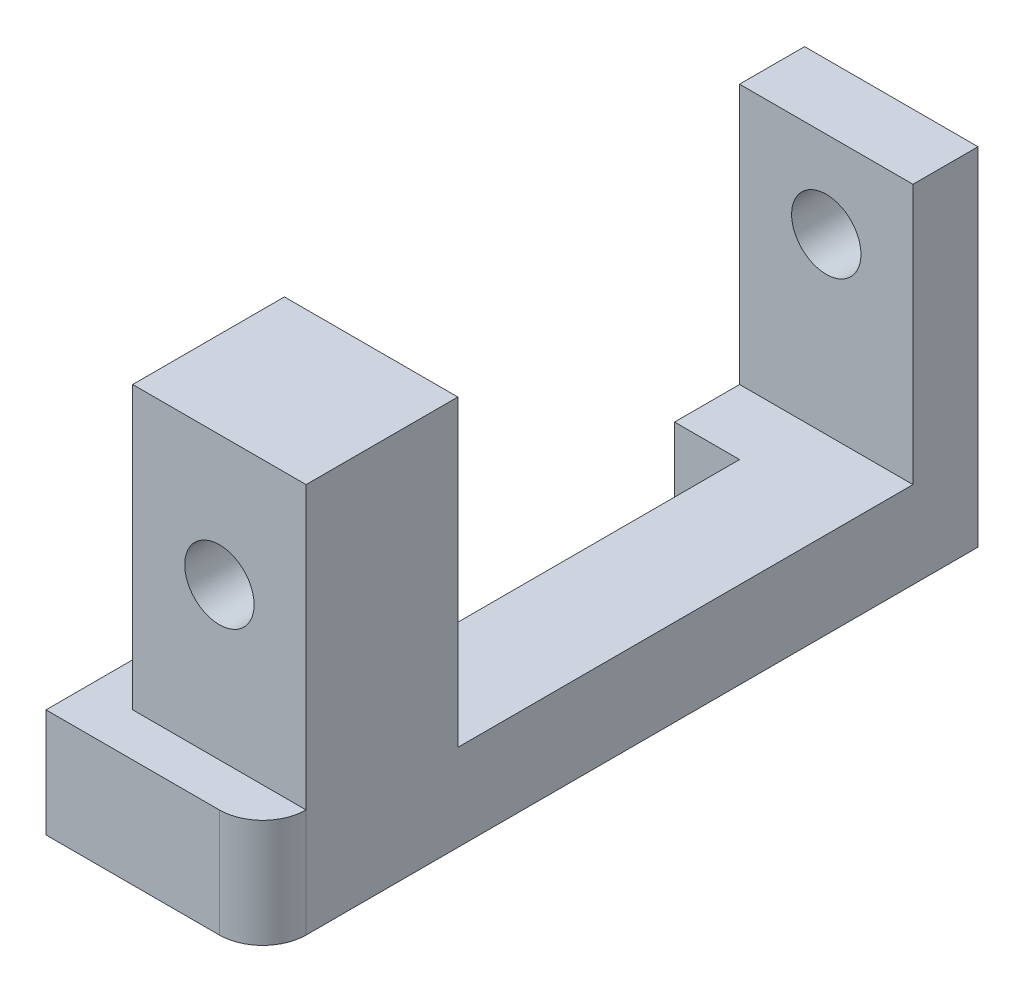
ISO-10303-21;
HEADER;
FILE_DESCRIPTION(('STEP AP214'),'2;1');
FILE_NAME('part.step','',(''),(''),'','','');
FILE_SCHEMA(('AUTOMOTIVE_DESIGN { 1 0 10303 214 1 1 1 1 }'));
ENDSEC;
DATA;
#1=APPLICATION_CONTEXT('core data for automotive mechanical design processes');
#2=APPLICATION_PROTOCOL_DEFINITION('international standard','automotive_design',2000,#1);
#3=PRODUCT_CONTEXT('',#1,'mechanical');
#4=PRODUCT('Part','Part','',(#3));
#5=PRODUCT_RELATED_PRODUCT_CATEGORY('part','',(#4));
#6=PRODUCT_DEFINITION_FORMATION('','',#4);
#7=PRODUCT_DEFINITION_CONTEXT('part definition',#1,'design');
#8=PRODUCT_DEFINITION('design','',#6,#7);
#9=PRODUCT_DEFINITION_SHAPE('','',#8);
#10=(LENGTH_UNIT() NAMED_UNIT(*) SI_UNIT(.MILLI.,.METRE.));
#11=(NAMED_UNIT(*) PLANE_ANGLE_UNIT() SI_UNIT($,.RADIAN.));
#12=(NAMED_UNIT(*) SI_UNIT($,.STERADIAN.) SOLID_ANGLE_UNIT());
#13=UNCERTAINTY_MEASURE_WITH_UNIT(LENGTH_MEASURE(1.E-05),#10,'distance_accuracy_value','');
#14=(GEOMETRIC_REPRESENTATION_CONTEXT(3) GLOBAL_UNCERTAINTY_ASSIGNED_CONTEXT((#13)) GLOBAL_UNIT_ASSIGNED_CONTEXT((#10,
#11,#12)) REPRESENTATION_CONTEXT('',''));
#15=CARTESIAN_POINT('',(0.,0.,0.));
#16=DIRECTION('',(0.,0.,1.));
#17=DIRECTION('',(1.,0.,0.));
#18=AXIS2_PLACEMENT_3D('',#15,#16,#17);
#19=CARTESIAN_POINT('',(-8.,0.,0.));
#20=DIRECTION('',(1.,0.,0.));
#21=DIRECTION('',(0.,0.,-1.));
#22=AXIS2_PLACEMENT_3D('',#19,#20,#21);
#23=PLANE('',#22);
#24=DIRECTION('',(0.,0.,1.));
#25=VECTOR('',#24,1.);
#26=CARTESIAN_POINT('',(-8.,5.,31.));
#27=LINE('',#26,#25);
#28=CARTESIAN_POINT('',(-8.,5.,24.));
#29=VERTEX_POINT('',#28);
#30=CARTESIAN_POINT('',(-8.,5.,31.));
#31=VERTEX_POINT('',#30);
#32=EDGE_CURVE('E280',#29,#31,#27,.T.);
#33=ORIENTED_EDGE('',*,*,#32,.T.);
#34=DIRECTION('',(0.,-1.,0.));
#35=VECTOR('',#34,1.);
#36=CARTESIAN_POINT('',(-8.,18.,31.));
#37=LINE('',#36,#35);
#38=CARTESIAN_POINT('',(-8.,18.,31.));
#39=VERTEX_POINT('',#38);
#40=EDGE_CURVE('E156',#39,#31,#37,.T.);
#41=ORIENTED_EDGE('',*,*,#40,.F.);
#42=DIRECTION('',(0.,0.,1.));
#43=VECTOR('',#42,1.);
#44=CARTESIAN_POINT('',(-8.,18.,24.));
#45=LINE('',#44,#43);
#46=CARTESIAN_POINT('',(-8.,18.,24.));
#47=VERTEX_POINT('',#46);
#48=EDGE_CURVE('E154',#47,#39,#45,.T.);
#49=ORIENTED_EDGE('',*,*,#48,.F.);
#50=DIRECTION('',(0.,1.,0.));
#51=VECTOR('',#50,1.);
#52=CARTESIAN_POINT('',(-8.,4.,24.));
#53=LINE('',#52,#51);
#54=EDGE_CURVE('E143',#29,#47,#53,.T.);
#55=ORIENTED_EDGE('',*,*,#54,.F.);
#56=EDGE_LOOP('',(#33,#41,#49,#55));
#57=FACE_BOUND('',#56,.T.);
#58=ADVANCED_FACE('F44',(#57),#23,.F.);
#59=CARTESIAN_POINT('',(-8.,18.,31.));
#60=DIRECTION('',(0.,0.,1.));
#61=DIRECTION('',(0.,-1.,0.));
#62=AXIS2_PLACEMENT_3D('',#59,#60,#61);
#63=PLANE('',#62);
#64=CARTESIAN_POINT('',(-4.,12.,31.));
#65=DIRECTION('',(0.,0.,1.));
#66=DIRECTION('',(1.,0.,0.));
#67=AXIS2_PLACEMENT_3D('',#64,#65,#66);
#68=CIRCLE('',#67,1.6);
#69=CARTESIAN_POINT('',(-2.4,12.,31.));
#70=VERTEX_POINT('',#69);
#71=EDGE_CURVE('E365',#70,#70,#68,.T.);
#72=ORIENTED_EDGE('',*,*,#71,.F.);
#73=EDGE_LOOP('',(#72));
#74=FACE_BOUND('',#73,.T.);
#75=ORIENTED_EDGE('',*,*,#40,.T.);
#76=DIRECTION('',(1.,0.,0.));
#77=VECTOR('',#76,1.);
#78=CARTESIAN_POINT('',(0.,5.,31.));
#79=LINE('',#78,#77);
#80=CARTESIAN_POINT('',(0.,5.,31.));
#81=VERTEX_POINT('',#80);
#82=EDGE_CURVE('E298',#31,#81,#79,.T.);
#83=ORIENTED_EDGE('',*,*,#82,.T.);
#84=DIRECTION('',(0.,-1.,0.));
#85=VECTOR('',#84,1.);
#86=CARTESIAN_POINT('',(0.,18.,31.));
#87=LINE('',#86,#85);
#88=CARTESIAN_POINT('',(0.,18.,31.));
#89=VERTEX_POINT('',#88);
#90=EDGE_CURVE('E177',#89,#81,#87,.T.);
#91=ORIENTED_EDGE('',*,*,#90,.F.);
#92=DIRECTION('',(1.,0.,0.));
#93=VECTOR('',#92,1.);
#94=CARTESIAN_POINT('',(-8.,18.,31.));
#95=LINE('',#94,#93);
#96=EDGE_CURVE('E13',#39,#89,#95,.T.);
#97=ORIENTED_EDGE('',*,*,#96,.F.);
#98=EDGE_LOOP('',(#75,#83,#91,#97));
#99=FACE_BOUND('',#98,.T.);
#100=ADVANCED_FACE('F325',(#74,#99),#63,.T.);
#101=CARTESIAN_POINT('',(-8.,16.,3.));
#102=DIRECTION('',(0.,0.,1.));
#103=DIRECTION('',(0.,-1.,0.));
#104=AXIS2_PLACEMENT_3D('',#101,#102,#103);
#105=PLANE('',#104);
#106=CARTESIAN_POINT('',(-4.,12.,3.));
#107=DIRECTION('',(0.,0.,1.));
#108=DIRECTION('',(0.,-1.,0.));
#109=AXIS2_PLACEMENT_3D('',#106,#107,#108);
#110=CIRCLE('',#109,1.6);
#111=CARTESIAN_POINT('',(-4.,10.4,3.));
#112=VERTEX_POINT('',#111);
#113=EDGE_CURVE('E305',#112,#112,#110,.T.);
#114=ORIENTED_EDGE('',*,*,#113,.F.);
#115=EDGE_LOOP('',(#114));
#116=FACE_BOUND('',#115,.T.);
#117=DIRECTION('',(0.,-1.,0.));
#118=VECTOR('',#117,1.);
#119=CARTESIAN_POINT('',(-8.,16.,3.));
#120=LINE('',#119,#118);
#121=CARTESIAN_POINT('',(-8.,16.,3.));
#122=VERTEX_POINT('',#121);
#123=CARTESIAN_POINT('',(-8.,4.,3.));
#124=VERTEX_POINT('',#123);
#125=EDGE_CURVE('E123',#122,#124,#120,.T.);
#126=ORIENTED_EDGE('',*,*,#125,.T.);
#127=DIRECTION('',(1.,0.,0.));
#128=VECTOR('',#127,1.);
#129=CARTESIAN_POINT('',(-8.,4.,3.));
#130=LINE('',#129,#128);
#131=CARTESIAN_POINT('',(0.,4.,3.));
#132=VERTEX_POINT('',#131);
#133=EDGE_CURVE('E130',#124,#132,#130,.T.);
#134=ORIENTED_EDGE('',*,*,#133,.T.);
#135=DIRECTION('',(0.,-1.,0.));
#136=VECTOR('',#135,1.);
#137=CARTESIAN_POINT('',(0.,16.,3.));
#138=LINE('',#137,#136);
#139=CARTESIAN_POINT('',(0.,16.,3.));
#140=VERTEX_POINT('',#139);
#141=EDGE_CURVE('E125',#140,#132,#138,.T.);
#142=ORIENTED_EDGE('',*,*,#141,.F.);
#143=DIRECTION('',(1.,0.,0.));
#144=VECTOR('',#143,1.);
#145=CARTESIAN_POINT('',(-8.,16.,3.));
#146=LINE('',#145,#144);
#147=EDGE_CURVE('E119',#122,#140,#146,.T.);
#148=ORIENTED_EDGE('',*,*,#147,.F.);
#149=EDGE_LOOP('',(#126,#134,#142,#148));
#150=FACE_BOUND('',#149,.T.);
#151=ADVANCED_FACE('F121',(#116,#150),#105,.T.);
#152=CARTESIAN_POINT('',(-3.,0.,30.4031242374328));
#153=DIRECTION('',(-0.894427190999916,-0.447213595499958,0.));
#154=DIRECTION('',(0.447213595499958,-0.894427190999916,0.));
#155=AXIS2_PLACEMENT_3D('',#152,#153,#154);
#156=PLANE('',#155);
#157=DIRECTION('',(0.,0.,-1.));
#158=VECTOR('',#157,1.);
#159=CARTESIAN_POINT('',(-5.,4.,30.4031242374328));
#160=LINE('',#159,#158);
#161=CARTESIAN_POINT('',(-5.,4.,24.));
#162=VERTEX_POINT('',#161);
#163=CARTESIAN_POINT('',(-5.,4.,6.));
#164=VERTEX_POINT('',#163);
#165=EDGE_CURVE('E214',#162,#164,#160,.T.);
#166=ORIENTED_EDGE('',*,*,#165,.T.);
#167=DIRECTION('',(-0.447213595499958,0.894427190999916,0.));
#168=VECTOR('',#167,1.);
#169=CARTESIAN_POINT('',(-5.,4.,6.));
#170=LINE('',#169,#168);
#171=CARTESIAN_POINT('',(-3.,0.,6.));
#172=VERTEX_POINT('',#171);
#173=EDGE_CURVE('E208',#172,#164,#170,.T.);
#174=ORIENTED_EDGE('',*,*,#173,.F.);
#175=DIRECTION('',(0.,0.,-1.));
#176=VECTOR('',#175,1.);
#177=CARTESIAN_POINT('',(-3.,0.,30.4031242374328));
#178=LINE('',#177,#176);
#179=CARTESIAN_POINT('',(-3.,0.,24.));
#180=VERTEX_POINT('',#179);
#181=EDGE_CURVE('E218',#180,#172,#178,.T.);
#182=ORIENTED_EDGE('',*,*,#181,.F.);
#183=DIRECTION('',(0.447213595499958,-0.894427190999916,0.));
#184=VECTOR('',#183,1.);
#185=CARTESIAN_POINT('',(-3.,0.,24.));
#186=LINE('',#185,#184);
#187=EDGE_CURVE('E215',#162,#180,#186,.T.);
#188=ORIENTED_EDGE('',*,*,#187,.F.);
#189=EDGE_LOOP('',(#166,#174,#182,#188));
#190=FACE_BOUND('',#189,.T.);
#191=ADVANCED_FACE('F229',(#190),#156,.T.);
#192=CARTESIAN_POINT('',(-8.,0.,31.));
#193=DIRECTION('',(0.,-1.,0.));
#194=DIRECTION('',(0.,0.,-1.));
#195=AXIS2_PLACEMENT_3D('',#192,#193,#194);
#196=PLANE('',#195);
#197=CARTESIAN_POINT('',(-5.715,0.,29.));
#198=DIRECTION('',(0.,-1.,0.));
#199=DIRECTION('',(0.,0.,-1.));
#200=AXIS2_PLACEMENT_3D('',#197,#198,#199);
#201=CIRCLE('',#200,1.49999999999999);
#202=CARTESIAN_POINT('',(-5.715,0.,27.5));
#203=VERTEX_POINT('',#202);
#204=EDGE_CURVE('E408',#203,#203,#201,.T.);
#205=ORIENTED_EDGE('',*,*,#204,.F.);
#206=EDGE_LOOP('',(#205));
#207=FACE_BOUND('',#206,.T.);
#208=CARTESIAN_POINT('',(-8.,0.,26.));
#209=DIRECTION('',(0.,-1.,0.));
#210=DIRECTION('',(0.,0.,-1.));
#211=AXIS2_PLACEMENT_3D('',#208,#209,#210);
#212=CIRCLE('',#211,2.);
#213=CARTESIAN_POINT('',(-10.,0.,26.));
#214=VERTEX_POINT('',#213);
#215=CARTESIAN_POINT('',(-8.,0.,24.));
#216=VERTEX_POINT('',#215);
#217=EDGE_CURVE('E303',#214,#216,#212,.T.);
#218=ORIENTED_EDGE('',*,*,#217,.T.);
#219=DIRECTION('',(-1.,0.,0.));
#220=VECTOR('',#219,1.);
#221=CARTESIAN_POINT('',(-8.,0.,24.));
#222=LINE('',#221,#220);
#223=EDGE_CURVE('E162',#180,#216,#222,.T.);
#224=ORIENTED_EDGE('',*,*,#223,.F.);
#225=ORIENTED_EDGE('',*,*,#181,.T.);
#226=DIRECTION('',(1.,0.,0.));
#227=VECTOR('',#226,1.);
#228=CARTESIAN_POINT('',(-3.,0.,6.));
#229=LINE('',#228,#227);
#230=CARTESIAN_POINT('',(-8.,0.,6.));
#231=VERTEX_POINT('',#230);
#232=EDGE_CURVE('E61',#231,#172,#229,.T.);
#233=ORIENTED_EDGE('',*,*,#232,.F.);
#234=DIRECTION('',(0.,0.,-1.));
#235=VECTOR('',#234,1.);
#236=CARTESIAN_POINT('',(-8.,0.,31.));
#237=LINE('',#236,#235);
#238=CARTESIAN_POINT('',(-8.,0.,0.));
#239=VERTEX_POINT('',#238);
#240=EDGE_CURVE('E109',#231,#239,#237,.T.);
#241=ORIENTED_EDGE('',*,*,#240,.T.);
#242=DIRECTION('',(1.,0.,0.));
#243=VECTOR('',#242,1.);
#244=CARTESIAN_POINT('',(-8.,0.,0.));
#245=LINE('',#244,#243);
#246=CARTESIAN_POINT('',(0.,0.,0.));
#247=VERTEX_POINT('',#246);
#248=EDGE_CURVE('E48',#239,#247,#245,.T.);
#249=ORIENTED_EDGE('',*,*,#248,.T.);
#250=DIRECTION('',(0.,0.,-1.));
#251=VECTOR('',#250,1.);
#252=CARTESIAN_POINT('',(0.,0.,31.));
#253=LINE('',#252,#251);
#254=CARTESIAN_POINT('',(0.,0.,31.));
#255=VERTEX_POINT('',#254);
#256=EDGE_CURVE('E158',#255,#247,#253,.T.);
#257=ORIENTED_EDGE('',*,*,#256,.F.);
#258=CARTESIAN_POINT('',(-2.,0.,31.));
#259=DIRECTION('',(0.,-1.,0.));
#260=DIRECTION('',(0.,0.,1.));
#261=AXIS2_PLACEMENT_3D('',#258,#259,#260);
#262=CIRCLE('',#261,2.);
#263=CARTESIAN_POINT('',(-2.,0.,33.));
#264=VERTEX_POINT('',#263);
#265=EDGE_CURVE('E102',#255,#264,#262,.T.);
#266=ORIENTED_EDGE('',*,*,#265,.T.);
#267=DIRECTION('',(-1.,0.,0.));
#268=VECTOR('',#267,1.);
#269=CARTESIAN_POINT('',(-10.,0.,33.));
#270=LINE('',#269,#268);
#271=CARTESIAN_POINT('',(-10.,0.,33.));
#272=VERTEX_POINT('',#271);
#273=EDGE_CURVE('E292',#264,#272,#270,.T.);
#274=ORIENTED_EDGE('',*,*,#273,.T.);
#275=DIRECTION('',(0.,0.,-1.));
#276=VECTOR('',#275,1.);
#277=CARTESIAN_POINT('',(-10.,0.,26.));
#278=LINE('',#277,#276);
#279=EDGE_CURVE('E308',#272,#214,#278,.T.);
#280=ORIENTED_EDGE('',*,*,#279,.T.);
#281=EDGE_LOOP('',(#218,#224,#225,#233,#241,#249,#257,#266,#274,#280));
#282=FACE_BOUND('',#281,.T.);
#283=ADVANCED_FACE('F46',(#207,#282),#196,.T.);
#284=CARTESIAN_POINT('',(-8.,4.,3.));
#285=DIRECTION('',(0.,1.,0.));
#286=DIRECTION('',(0.,0.,1.));
#287=AXIS2_PLACEMENT_3D('',#284,#285,#286);
#288=PLANE('',#287);
#289=ORIENTED_EDGE('',*,*,#133,.F.);
#290=DIRECTION('',(0.,0.,-1.));
#291=VECTOR('',#290,1.);
#292=CARTESIAN_POINT('',(-8.,4.,6.));
#293=LINE('',#292,#291);
#294=CARTESIAN_POINT('',(-8.,4.,6.));
#295=VERTEX_POINT('',#294);
#296=EDGE_CURVE('E142',#295,#124,#293,.T.);
#297=ORIENTED_EDGE('',*,*,#296,.F.);
#298=DIRECTION('',(-1.,0.,0.));
#299=VECTOR('',#298,1.);
#300=CARTESIAN_POINT('',(-8.,4.,6.));
#301=LINE('',#300,#299);
#302=EDGE_CURVE('E210',#164,#295,#301,.T.);
#303=ORIENTED_EDGE('',*,*,#302,.F.);
#304=ORIENTED_EDGE('',*,*,#165,.F.);
#305=DIRECTION('',(1.,0.,0.));
#306=VECTOR('',#305,1.);
#307=CARTESIAN_POINT('',(-8.,4.,24.));
#308=LINE('',#307,#306);
#309=CARTESIAN_POINT('',(0.,4.,24.));
#310=VERTEX_POINT('',#309);
#311=EDGE_CURVE('E181',#162,#310,#308,.T.);
#312=ORIENTED_EDGE('',*,*,#311,.T.);
#313=DIRECTION('',(0.,0.,1.));
#314=VECTOR('',#313,1.);
#315=CARTESIAN_POINT('',(0.,4.,3.));
#316=LINE('',#315,#314);
#317=EDGE_CURVE('E168',#132,#310,#316,.T.);
#318=ORIENTED_EDGE('',*,*,#317,.F.);
#319=EDGE_LOOP('',(#289,#297,#303,#304,#312,#318));
#320=FACE_BOUND('',#319,.T.);
#321=ADVANCED_FACE('F241',(#320),#288,.T.);
#322=ORIENTED_EDGE('',*,*,#240,.F.);
#323=DIRECTION('',(0.,-1.,0.));
#324=VECTOR('',#323,1.);
#325=CARTESIAN_POINT('',(-8.,0.,6.));
#326=LINE('',#325,#324);
#327=EDGE_CURVE('E204',#295,#231,#326,.T.);
#328=ORIENTED_EDGE('',*,*,#327,.F.);
#329=ORIENTED_EDGE('',*,*,#296,.T.);
#330=ORIENTED_EDGE('',*,*,#125,.F.);
#331=DIRECTION('',(0.,0.,1.));
#332=VECTOR('',#331,1.);
#333=CARTESIAN_POINT('',(-8.,16.,0.));
#334=LINE('',#333,#332);
#335=CARTESIAN_POINT('',(-8.,16.,0.));
#336=VERTEX_POINT('',#335);
#337=EDGE_CURVE('E138',#336,#122,#334,.T.);
#338=ORIENTED_EDGE('',*,*,#337,.F.);
#339=DIRECTION('',(0.,1.,0.));
#340=VECTOR('',#339,1.);
#341=CARTESIAN_POINT('',(-8.,0.,0.));
#342=LINE('',#341,#340);
#343=EDGE_CURVE('E146',#239,#336,#342,.T.);
#344=ORIENTED_EDGE('',*,*,#343,.F.);
#345=EDGE_LOOP('',(#322,#328,#329,#330,#338,#344));
#346=FACE_BOUND('',#345,.T.);
#347=ADVANCED_FACE('F136',(#346),#23,.F.);
#348=CARTESIAN_POINT('',(-8.,18.,24.));
#349=DIRECTION('',(0.,1.,0.));
#350=DIRECTION('',(0.,0.,1.));
#351=AXIS2_PLACEMENT_3D('',#348,#349,#350);
#352=PLANE('',#351);
#353=DIRECTION('',(0.,0.,1.));
#354=VECTOR('',#353,1.);
#355=CARTESIAN_POINT('',(0.,18.,24.));
#356=LINE('',#355,#354);
#357=CARTESIAN_POINT('',(0.,18.,24.));
#358=VERTEX_POINT('',#357);
#359=EDGE_CURVE('E174',#358,#89,#356,.T.);
#360=ORIENTED_EDGE('',*,*,#359,.F.);
#361=DIRECTION('',(1.,0.,0.));
#362=VECTOR('',#361,1.);
#363=CARTESIAN_POINT('',(-8.,18.,24.));
#364=LINE('',#363,#362);
#365=EDGE_CURVE('E53',#47,#358,#364,.T.);
#366=ORIENTED_EDGE('',*,*,#365,.F.);
#367=ORIENTED_EDGE('',*,*,#48,.T.);
#368=ORIENTED_EDGE('',*,*,#96,.T.);
#369=EDGE_LOOP('',(#360,#366,#367,#368));
#370=FACE_BOUND('',#369,.T.);
#371=ADVANCED_FACE('F336',(#370),#352,.T.);
#372=CARTESIAN_POINT('',(-8.,4.,24.));
#373=DIRECTION('',(0.,0.,-1.));
#374=DIRECTION('',(-1.,0.,0.));
#375=AXIS2_PLACEMENT_3D('',#372,#373,#374);
#376=PLANE('',#375);
#377=CARTESIAN_POINT('',(-4.,12.,24.));
#378=DIRECTION('',(0.,0.,-1.));
#379=DIRECTION('',(-1.,0.,0.));
#380=AXIS2_PLACEMENT_3D('',#377,#378,#379);
#381=CIRCLE('',#380,1.6);
#382=CARTESIAN_POINT('',(-5.6,12.,24.));
#383=VERTEX_POINT('',#382);
#384=EDGE_CURVE('E364',#383,#383,#381,.T.);
#385=ORIENTED_EDGE('',*,*,#384,.F.);
#386=EDGE_LOOP('',(#385));
#387=FACE_BOUND('',#386,.T.);
#388=DIRECTION('',(0.,1.,0.));
#389=VECTOR('',#388,1.);
#390=CARTESIAN_POINT('',(0.,4.,24.));
#391=LINE('',#390,#389);
#392=EDGE_CURVE('E171',#310,#358,#391,.T.);
#393=ORIENTED_EDGE('',*,*,#392,.F.);
#394=ORIENTED_EDGE('',*,*,#311,.F.);
#395=ORIENTED_EDGE('',*,*,#187,.T.);
#396=ORIENTED_EDGE('',*,*,#223,.T.);
#397=EDGE_CURVE('E151',#216,#29,#53,.T.);
#398=ORIENTED_EDGE('',*,*,#397,.T.);
#399=ORIENTED_EDGE('',*,*,#54,.T.);
#400=ORIENTED_EDGE('',*,*,#365,.T.);
#401=EDGE_LOOP('',(#393,#394,#395,#396,#398,#399,#400));
#402=FACE_BOUND('',#401,.T.);
#403=ADVANCED_FACE('F235',(#387,#402),#376,.T.);
#404=CARTESIAN_POINT('',(-8.,16.,0.));
#405=DIRECTION('',(0.,1.,0.));
#406=DIRECTION('',(0.,0.,1.));
#407=AXIS2_PLACEMENT_3D('',#404,#405,#406);
#408=PLANE('',#407);
#409=DIRECTION('',(0.,0.,1.));
#410=VECTOR('',#409,1.);
#411=CARTESIAN_POINT('',(0.,16.,0.));
#412=LINE('',#411,#410);
#413=CARTESIAN_POINT('',(0.,16.,0.));
#414=VERTEX_POINT('',#413);
#415=EDGE_CURVE('E165',#414,#140,#412,.T.);
#416=ORIENTED_EDGE('',*,*,#415,.F.);
#417=DIRECTION('',(1.,0.,0.));
#418=VECTOR('',#417,1.);
#419=CARTESIAN_POINT('',(-8.,16.,0.));
#420=LINE('',#419,#418);
#421=EDGE_CURVE('E131',#336,#414,#420,.T.);
#422=ORIENTED_EDGE('',*,*,#421,.F.);
#423=ORIENTED_EDGE('',*,*,#337,.T.);
#424=ORIENTED_EDGE('',*,*,#147,.T.);
#425=EDGE_LOOP('',(#416,#422,#423,#424));
#426=FACE_BOUND('',#425,.T.);
#427=ADVANCED_FACE('F145',(#426),#408,.T.);
#428=CARTESIAN_POINT('',(-8.,0.,0.));
#429=DIRECTION('',(0.,0.,-1.));
#430=DIRECTION('',(-1.,0.,0.));
#431=AXIS2_PLACEMENT_3D('',#428,#429,#430);
#432=PLANE('',#431);
#433=CARTESIAN_POINT('',(-4.,12.,0.));
#434=DIRECTION('',(0.,0.,1.));
#435=DIRECTION('',(1.,0.,0.));
#436=AXIS2_PLACEMENT_3D('',#433,#434,#435);
#437=CIRCLE('',#436,1.6);
#438=CARTESIAN_POINT('',(-2.4,12.,0.));
#439=VERTEX_POINT('',#438);
#440=EDGE_CURVE('E362',#439,#439,#437,.T.);
#441=ORIENTED_EDGE('',*,*,#440,.T.);
#442=EDGE_LOOP('',(#441));
#443=FACE_BOUND('',#442,.T.);
#444=DIRECTION('',(0.,1.,0.));
#445=VECTOR('',#444,1.);
#446=CARTESIAN_POINT('',(0.,0.,0.));
#447=LINE('',#446,#445);
#448=EDGE_CURVE('E161',#247,#414,#447,.T.);
#449=ORIENTED_EDGE('',*,*,#448,.F.);
#450=ORIENTED_EDGE('',*,*,#248,.F.);
#451=ORIENTED_EDGE('',*,*,#343,.T.);
#452=ORIENTED_EDGE('',*,*,#421,.T.);
#453=EDGE_LOOP('',(#449,#450,#451,#452));
#454=FACE_BOUND('',#453,.T.);
#455=ADVANCED_FACE('F187',(#443,#454),#432,.T.);
#456=CARTESIAN_POINT('',(0.,0.,0.));
#457=DIRECTION('',(1.,0.,0.));
#458=DIRECTION('',(0.,0.,-1.));
#459=AXIS2_PLACEMENT_3D('',#456,#457,#458);
#460=PLANE('',#459);
#461=ORIENTED_EDGE('',*,*,#256,.T.);
#462=ORIENTED_EDGE('',*,*,#448,.T.);
#463=ORIENTED_EDGE('',*,*,#415,.T.);
#464=ORIENTED_EDGE('',*,*,#141,.T.);
#465=ORIENTED_EDGE('',*,*,#317,.T.);
#466=ORIENTED_EDGE('',*,*,#392,.T.);
#467=ORIENTED_EDGE('',*,*,#359,.T.);
#468=ORIENTED_EDGE('',*,*,#90,.T.);
#469=DIRECTION('',(0.,-1.,0.));
#470=VECTOR('',#469,1.);
#471=CARTESIAN_POINT('',(0.,5.,31.));
#472=LINE('',#471,#470);
#473=EDGE_CURVE('E190',#81,#255,#472,.T.);
#474=ORIENTED_EDGE('',*,*,#473,.T.);
#475=EDGE_LOOP('',(#461,#462,#463,#464,#465,#466,#467,#468,#474));
#476=FACE_BOUND('',#475,.T.);
#477=ADVANCED_FACE('F189',(#476),#460,.T.);
#478=CARTESIAN_POINT('',(0.,0.,6.));
#479=DIRECTION('',(0.,0.,-1.));
#480=DIRECTION('',(-1.,0.,0.));
#481=AXIS2_PLACEMENT_3D('',#478,#479,#480);
#482=PLANE('',#481);
#483=ORIENTED_EDGE('',*,*,#327,.T.);
#484=ORIENTED_EDGE('',*,*,#232,.T.);
#485=ORIENTED_EDGE('',*,*,#173,.T.);
#486=ORIENTED_EDGE('',*,*,#302,.T.);
#487=EDGE_LOOP('',(#483,#484,#485,#486));
#488=FACE_BOUND('',#487,.T.);
#489=ADVANCED_FACE('F321',(#488),#482,.F.);
#490=CARTESIAN_POINT('',(-8.,5.,26.));
#491=DIRECTION('',(0.,-1.,0.));
#492=DIRECTION('',(0.,0.,-1.));
#493=AXIS2_PLACEMENT_3D('',#490,#491,#492);
#494=CYLINDRICAL_SURFACE('',#493,2.);
#495=ORIENTED_EDGE('',*,*,#217,.F.);
#496=DIRECTION('',(0.,-1.,0.));
#497=VECTOR('',#496,1.);
#498=CARTESIAN_POINT('',(-10.,5.,26.));
#499=LINE('',#498,#497);
#500=CARTESIAN_POINT('',(-10.,5.,26.));
#501=VERTEX_POINT('',#500);
#502=EDGE_CURVE('E206',#501,#214,#499,.T.);
#503=ORIENTED_EDGE('',*,*,#502,.F.);
#504=CARTESIAN_POINT('',(-8.,5.,26.));
#505=DIRECTION('',(0.,-1.,0.));
#506=DIRECTION('',(0.,0.,-1.));
#507=AXIS2_PLACEMENT_3D('',#504,#505,#506);
#508=CIRCLE('',#507,2.);
#509=EDGE_CURVE('E311',#501,#29,#508,.T.);
#510=ORIENTED_EDGE('',*,*,#509,.T.);
#511=ORIENTED_EDGE('',*,*,#397,.F.);
#512=EDGE_LOOP('',(#495,#503,#510,#511));
#513=FACE_BOUND('',#512,.T.);
#514=ADVANCED_FACE('F314',(#513),#494,.T.);
#515=CARTESIAN_POINT('',(-10.,5.,26.));
#516=DIRECTION('',(-1.,0.,0.));
#517=DIRECTION('',(0.,0.,1.));
#518=AXIS2_PLACEMENT_3D('',#515,#516,#517);
#519=PLANE('',#518);
#520=ORIENTED_EDGE('',*,*,#279,.F.);
#521=DIRECTION('',(0.,-1.,0.));
#522=VECTOR('',#521,1.);
#523=CARTESIAN_POINT('',(-10.,5.,33.));
#524=LINE('',#523,#522);
#525=CARTESIAN_POINT('',(-10.,5.,33.));
#526=VERTEX_POINT('',#525);
#527=EDGE_CURVE('E197',#526,#272,#524,.T.);
#528=ORIENTED_EDGE('',*,*,#527,.F.);
#529=DIRECTION('',(0.,0.,-1.));
#530=VECTOR('',#529,1.);
#531=CARTESIAN_POINT('',(-10.,5.,26.));
#532=LINE('',#531,#530);
#533=EDGE_CURVE('E195',#526,#501,#532,.T.);
#534=ORIENTED_EDGE('',*,*,#533,.T.);
#535=ORIENTED_EDGE('',*,*,#502,.T.);
#536=EDGE_LOOP('',(#520,#528,#534,#535));
#537=FACE_BOUND('',#536,.T.);
#538=ADVANCED_FACE('F312',(#537),#519,.T.);
#539=CARTESIAN_POINT('',(-10.,5.,33.));
#540=DIRECTION('',(0.,0.,1.));
#541=DIRECTION('',(1.,0.,0.));
#542=AXIS2_PLACEMENT_3D('',#539,#540,#541);
#543=PLANE('',#542);
#544=ORIENTED_EDGE('',*,*,#273,.F.);
#545=DIRECTION('',(0.,-1.,0.));
#546=VECTOR('',#545,1.);
#547=CARTESIAN_POINT('',(-2.,5.,33.));
#548=LINE('',#547,#546);
#549=CARTESIAN_POINT('',(-2.,5.,33.));
#550=VERTEX_POINT('',#549);
#551=EDGE_CURVE('E194',#550,#264,#548,.T.);
#552=ORIENTED_EDGE('',*,*,#551,.F.);
#553=DIRECTION('',(-1.,0.,0.));
#554=VECTOR('',#553,1.);
#555=CARTESIAN_POINT('',(-10.,5.,33.));
#556=LINE('',#555,#554);
#557=EDGE_CURVE('E200',#550,#526,#556,.T.);
#558=ORIENTED_EDGE('',*,*,#557,.T.);
#559=ORIENTED_EDGE('',*,*,#527,.T.);
#560=EDGE_LOOP('',(#544,#552,#558,#559));
#561=FACE_BOUND('',#560,.T.);
#562=ADVANCED_FACE('F289',(#561),#543,.T.);
#563=CARTESIAN_POINT('',(-2.,5.,31.));
#564=DIRECTION('',(0.,-1.,0.));
#565=DIRECTION('',(0.,0.,-1.));
#566=AXIS2_PLACEMENT_3D('',#563,#564,#565);
#567=CYLINDRICAL_SURFACE('',#566,2.);
#568=ORIENTED_EDGE('',*,*,#265,.F.);
#569=ORIENTED_EDGE('',*,*,#473,.F.);
#570=CARTESIAN_POINT('',(-2.,5.,31.));
#571=DIRECTION('',(0.,-1.,0.));
#572=DIRECTION('',(0.,0.,1.));
#573=AXIS2_PLACEMENT_3D('',#570,#571,#572);
#574=CIRCLE('',#573,2.);
#575=EDGE_CURVE('E294',#81,#550,#574,.T.);
#576=ORIENTED_EDGE('',*,*,#575,.T.);
#577=ORIENTED_EDGE('',*,*,#551,.T.);
#578=EDGE_LOOP('',(#568,#569,#576,#577));
#579=FACE_BOUND('',#578,.T.);
#580=ADVANCED_FACE('F297',(#579),#567,.T.);
#581=CARTESIAN_POINT('',(-8.,5.,26.));
#582=DIRECTION('',(0.,-1.,0.));
#583=DIRECTION('',(0.,0.,-1.));
#584=AXIS2_PLACEMENT_3D('',#581,#582,#583);
#585=PLANE('',#584);
#586=ORIENTED_EDGE('',*,*,#509,.F.);
#587=ORIENTED_EDGE('',*,*,#533,.F.);
#588=ORIENTED_EDGE('',*,*,#557,.F.);
#589=ORIENTED_EDGE('',*,*,#575,.F.);
#590=ORIENTED_EDGE('',*,*,#82,.F.);
#591=ORIENTED_EDGE('',*,*,#32,.F.);
#592=EDGE_LOOP('',(#586,#587,#588,#589,#590,#591));
#593=FACE_BOUND('',#592,.T.);
#594=ADVANCED_FACE('F293',(#593),#585,.F.);
#595=CARTESIAN_POINT('',(-4.,12.,0.));
#596=DIRECTION('',(0.,0.,1.));
#597=DIRECTION('',(1.,0.,0.));
#598=AXIS2_PLACEMENT_3D('',#595,#596,#597);
#599=CYLINDRICAL_SURFACE('',#598,1.6);
#600=ORIENTED_EDGE('',*,*,#113,.T.);
#601=EDGE_LOOP('',(#600));
#602=FACE_BOUND('',#601,.T.);
#603=ORIENTED_EDGE('',*,*,#440,.F.);
#604=EDGE_LOOP('',(#603));
#605=FACE_BOUND('',#604,.T.);
#606=ADVANCED_FACE('F384',(#602,#605),#599,.F.);
#607=ORIENTED_EDGE('',*,*,#384,.T.);
#608=EDGE_LOOP('',(#607));
#609=FACE_BOUND('',#608,.T.);
#610=ORIENTED_EDGE('',*,*,#71,.T.);
#611=EDGE_LOOP('',(#610));
#612=FACE_BOUND('',#611,.T.);
#613=ADVANCED_FACE('F386',(#609,#612),#599,.F.);
#614=CARTESIAN_POINT('',(-5.715,5.,29.));
#615=DIRECTION('',(0.,-1.,0.));
#616=DIRECTION('',(0.,0.,-1.));
#617=AXIS2_PLACEMENT_3D('',#614,#615,#616);
#618=CONICAL_SURFACE('',#617,1.49999999999999,1.02974425867665);
#619=CARTESIAN_POINT('',(-5.715,5.90129092854134,29.));
#620=VERTEX_POINT('',#619);
#621=VERTEX_LOOP('',#620);
#622=FACE_BOUND('',#621,.T.);
#623=CARTESIAN_POINT('',(-5.715,5.,29.));
#624=DIRECTION('',(0.,-1.,0.));
#625=DIRECTION('',(0.,0.,-1.));
#626=AXIS2_PLACEMENT_3D('',#623,#624,#625);
#627=CIRCLE('',#626,1.49999999999999);
#628=CARTESIAN_POINT('',(-5.715,5.,27.5));
#629=VERTEX_POINT('',#628);
#630=EDGE_CURVE('E370',#629,#629,#627,.T.);
#631=ORIENTED_EDGE('',*,*,#630,.T.);
#632=EDGE_LOOP('',(#631));
#633=FACE_BOUND('',#632,.T.);
#634=ADVANCED_FACE('F392',(#622,#633),#618,.F.);
#635=CARTESIAN_POINT('',(-5.715,0.,29.));
#636=DIRECTION('',(0.,-1.,0.));
#637=DIRECTION('',(0.,0.,-1.));
#638=AXIS2_PLACEMENT_3D('',#635,#636,#637);
#639=CYLINDRICAL_SURFACE('',#638,1.49999999999999);
#640=ORIENTED_EDGE('',*,*,#630,.F.);
#641=EDGE_LOOP('',(#640));
#642=FACE_BOUND('',#641,.T.);
#643=ORIENTED_EDGE('',*,*,#204,.T.);
#644=EDGE_LOOP('',(#643));
#645=FACE_BOUND('',#644,.T.);
#646=ADVANCED_FACE('F397',(#642,#645),#639,.F.);
#647=CLOSED_SHELL('',(#58,#100,#151,#191,#283,#321,#347,#371,#403,#427,#455,#477,#489,#514,#538,
#562,#580,#594,#606,#613,#634,#646));
#648=MANIFOLD_SOLID_BREP('B2',#647);
#649=ADVANCED_BREP_SHAPE_REPRESENTATION('',(#18,#648),#14);
#650=SHAPE_DEFINITION_REPRESENTATION(#9,#649);
ENDSEC;
END-ISO-10303-21;
